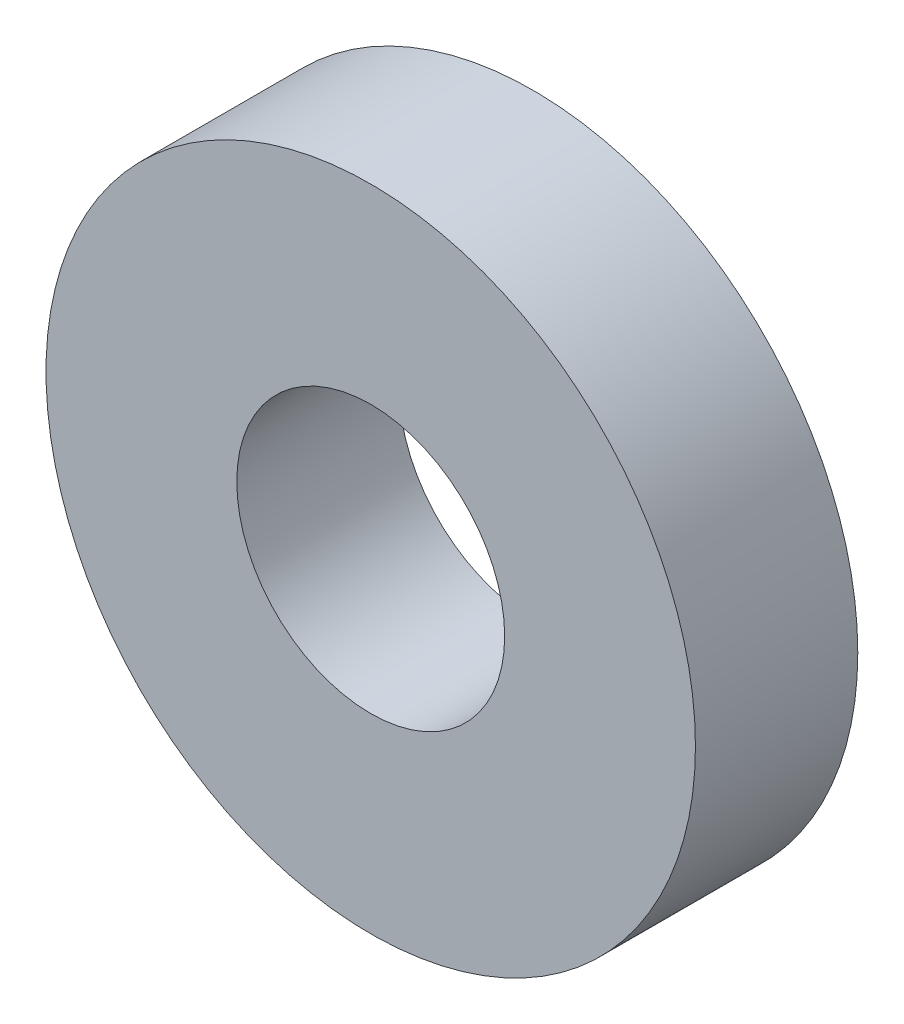
ISO-10303-21;
HEADER;
FILE_DESCRIPTION(('STEP AP214'),'2;1');
FILE_NAME('part.step','',(''),(''),'','','');
FILE_SCHEMA(('AUTOMOTIVE_DESIGN { 1 0 10303 214 1 1 1 1 }'));
ENDSEC;
DATA;
#1=APPLICATION_CONTEXT('core data for automotive mechanical design processes');
#2=APPLICATION_PROTOCOL_DEFINITION('international standard','automotive_design',2000,#1);
#3=PRODUCT_CONTEXT('',#1,'mechanical');
#4=PRODUCT('Part','Part','',(#3));
#5=PRODUCT_RELATED_PRODUCT_CATEGORY('part','',(#4));
#6=PRODUCT_DEFINITION_FORMATION('','',#4);
#7=PRODUCT_DEFINITION_CONTEXT('part definition',#1,'design');
#8=PRODUCT_DEFINITION('design','',#6,#7);
#9=PRODUCT_DEFINITION_SHAPE('','',#8);
#10=(LENGTH_UNIT() NAMED_UNIT(*) SI_UNIT(.MILLI.,.METRE.));
#11=(NAMED_UNIT(*) PLANE_ANGLE_UNIT() SI_UNIT($,.RADIAN.));
#12=(NAMED_UNIT(*) SI_UNIT($,.STERADIAN.) SOLID_ANGLE_UNIT());
#13=UNCERTAINTY_MEASURE_WITH_UNIT(LENGTH_MEASURE(1.E-05),#10,'distance_accuracy_value','');
#14=(GEOMETRIC_REPRESENTATION_CONTEXT(3) GLOBAL_UNCERTAINTY_ASSIGNED_CONTEXT((#13)) GLOBAL_UNIT_ASSIGNED_CONTEXT((#10,
#11,#12)) REPRESENTATION_CONTEXT('',''));
#15=CARTESIAN_POINT('',(0.,0.,0.));
#16=DIRECTION('',(0.,0.,1.));
#17=DIRECTION('',(1.,0.,0.));
#18=AXIS2_PLACEMENT_3D('',#15,#16,#17);
#19=CARTESIAN_POINT('',(0.,0.,2.));
#20=DIRECTION('',(0.,0.,1.));
#21=DIRECTION('',(1.,0.,0.));
#22=AXIS2_PLACEMENT_3D('',#19,#20,#21);
#23=PLANE('',#22);
#24=CARTESIAN_POINT('',(0.,0.,2.));
#25=DIRECTION('',(0.,0.,1.));
#26=DIRECTION('',(1.,0.,0.));
#27=AXIS2_PLACEMENT_3D('',#24,#25,#26);
#28=CIRCLE('',#27,4.);
#29=CARTESIAN_POINT('',(4.,0.,2.));
#30=VERTEX_POINT('',#29);
#31=EDGE_CURVE('E11',#30,#30,#28,.T.);
#32=ORIENTED_EDGE('',*,*,#31,.T.);
#33=EDGE_LOOP('',(#32));
#34=FACE_BOUND('',#33,.T.);
#35=CARTESIAN_POINT('',(0.,0.,2.));
#36=DIRECTION('',(0.,0.,1.));
#37=DIRECTION('',(1.,0.,0.));
#38=AXIS2_PLACEMENT_3D('',#35,#36,#37);
#39=CIRCLE('',#38,1.65);
#40=CARTESIAN_POINT('',(1.65,0.,2.));
#41=VERTEX_POINT('',#40);
#42=EDGE_CURVE('E62',#41,#41,#39,.T.);
#43=ORIENTED_EDGE('',*,*,#42,.F.);
#44=EDGE_LOOP('',(#43));
#45=FACE_BOUND('',#44,.T.);
#46=ADVANCED_FACE('F47',(#34,#45),#23,.T.);
#47=CARTESIAN_POINT('',(0.,0.,0.));
#48=DIRECTION('',(0.,0.,1.));
#49=DIRECTION('',(1.,0.,0.));
#50=AXIS2_PLACEMENT_3D('',#47,#48,#49);
#51=PLANE('',#50);
#52=CARTESIAN_POINT('',(0.,0.,0.));
#53=DIRECTION('',(0.,0.,1.));
#54=DIRECTION('',(1.,0.,0.));
#55=AXIS2_PLACEMENT_3D('',#52,#53,#54);
#56=CIRCLE('',#55,4.);
#57=CARTESIAN_POINT('',(4.,0.,0.));
#58=VERTEX_POINT('',#57);
#59=EDGE_CURVE('E51',#58,#58,#56,.T.);
#60=ORIENTED_EDGE('',*,*,#59,.F.);
#61=EDGE_LOOP('',(#60));
#62=FACE_BOUND('',#61,.T.);
#63=CARTESIAN_POINT('',(0.,0.,0.));
#64=DIRECTION('',(0.,0.,1.));
#65=DIRECTION('',(1.,0.,0.));
#66=AXIS2_PLACEMENT_3D('',#63,#64,#65);
#67=CIRCLE('',#66,1.65);
#68=CARTESIAN_POINT('',(1.65,0.,0.));
#69=VERTEX_POINT('',#68);
#70=EDGE_CURVE('E65',#69,#69,#67,.T.);
#71=ORIENTED_EDGE('',*,*,#70,.T.);
#72=EDGE_LOOP('',(#71));
#73=FACE_BOUND('',#72,.T.);
#74=ADVANCED_FACE('F77',(#62,#73),#51,.F.);
#75=CARTESIAN_POINT('',(0.,0.,2.));
#76=DIRECTION('',(0.,0.,-1.));
#77=DIRECTION('',(-1.,0.,0.));
#78=AXIS2_PLACEMENT_3D('',#75,#76,#77);
#79=CYLINDRICAL_SURFACE('',#78,4.);
#80=ORIENTED_EDGE('',*,*,#31,.F.);
#81=EDGE_LOOP('',(#80));
#82=FACE_BOUND('',#81,.T.);
#83=ORIENTED_EDGE('',*,*,#59,.T.);
#84=EDGE_LOOP('',(#83));
#85=FACE_BOUND('',#84,.T.);
#86=ADVANCED_FACE('F49',(#82,#85),#79,.T.);
#87=CARTESIAN_POINT('',(0.,0.,2.));
#88=DIRECTION('',(0.,0.,-1.));
#89=DIRECTION('',(-1.,0.,0.));
#90=AXIS2_PLACEMENT_3D('',#87,#88,#89);
#91=CYLINDRICAL_SURFACE('',#90,1.65);
#92=ORIENTED_EDGE('',*,*,#42,.T.);
#93=EDGE_LOOP('',(#92));
#94=FACE_BOUND('',#93,.T.);
#95=ORIENTED_EDGE('',*,*,#70,.F.);
#96=EDGE_LOOP('',(#95));
#97=FACE_BOUND('',#96,.T.);
#98=ADVANCED_FACE('F73',(#94,#97),#91,.F.);
#99=CLOSED_SHELL('',(#46,#74,#86,#98));
#100=MANIFOLD_SOLID_BREP('B2',#99);
#101=ADVANCED_BREP_SHAPE_REPRESENTATION('',(#18,#100),#14);
#102=SHAPE_DEFINITION_REPRESENTATION(#9,#101);
ENDSEC;
END-ISO-10303-21;
